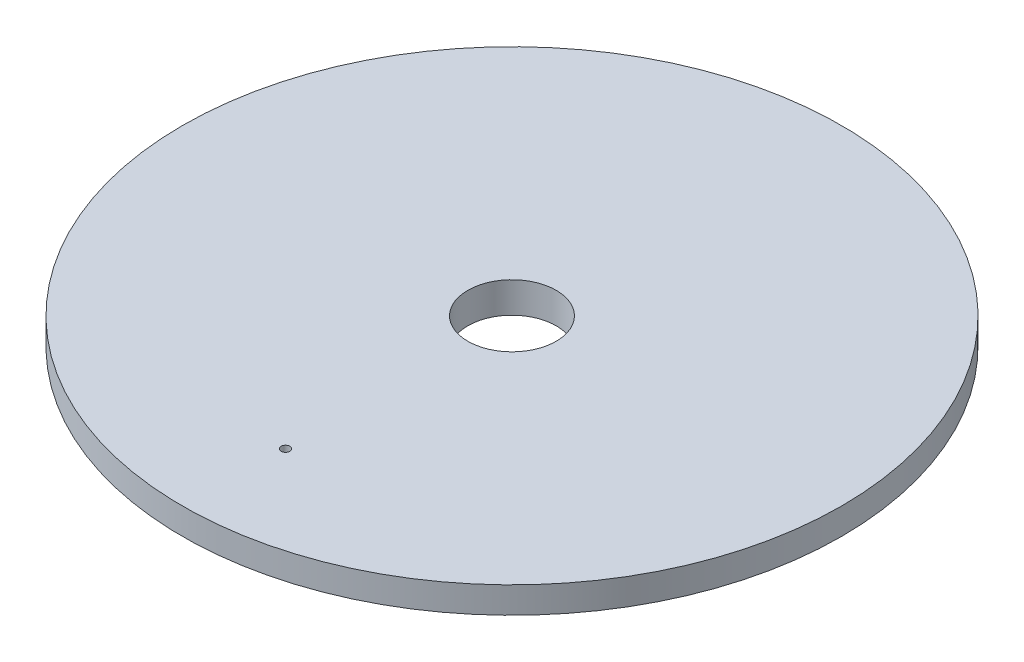
ISO-10303-21;
HEADER;
FILE_DESCRIPTION(('STEP AP214'),'2;1');
FILE_NAME('part.step','',(''),(''),'','','');
FILE_SCHEMA(('AUTOMOTIVE_DESIGN { 1 0 10303 214 1 1 1 1 }'));
ENDSEC;
DATA;
#1=APPLICATION_CONTEXT('core data for automotive mechanical design processes');
#2=APPLICATION_PROTOCOL_DEFINITION('international standard','automotive_design',2000,#1);
#3=PRODUCT_CONTEXT('',#1,'mechanical');
#4=PRODUCT('Part','Part','',(#3));
#5=PRODUCT_RELATED_PRODUCT_CATEGORY('part','',(#4));
#6=PRODUCT_DEFINITION_FORMATION('','',#4);
#7=PRODUCT_DEFINITION_CONTEXT('part definition',#1,'design');
#8=PRODUCT_DEFINITION('design','',#6,#7);
#9=PRODUCT_DEFINITION_SHAPE('','',#8);
#10=(LENGTH_UNIT() NAMED_UNIT(*) SI_UNIT(.MILLI.,.METRE.));
#11=(NAMED_UNIT(*) PLANE_ANGLE_UNIT() SI_UNIT($,.RADIAN.));
#12=(NAMED_UNIT(*) SI_UNIT($,.STERADIAN.) SOLID_ANGLE_UNIT());
#13=UNCERTAINTY_MEASURE_WITH_UNIT(LENGTH_MEASURE(1.E-05),#10,'distance_accuracy_value','');
#14=(GEOMETRIC_REPRESENTATION_CONTEXT(3) GLOBAL_UNCERTAINTY_ASSIGNED_CONTEXT((#13)) GLOBAL_UNIT_ASSIGNED_CONTEXT((#10,
#11,#12)) REPRESENTATION_CONTEXT('',''));
#15=CARTESIAN_POINT('',(0.,0.,0.));
#16=DIRECTION('',(0.,0.,1.));
#17=DIRECTION('',(1.,0.,0.));
#18=AXIS2_PLACEMENT_3D('',#15,#16,#17);
#19=CARTESIAN_POINT('',(0.,0.,0.));
#20=DIRECTION('',(0.,1.,0.));
#21=DIRECTION('',(-1.,0.,0.));
#22=AXIS2_PLACEMENT_3D('',#19,#20,#21);
#23=CYLINDRICAL_SURFACE('',#22,10.055);
#24=CARTESIAN_POINT('',(0.,-7.,0.));
#25=DIRECTION('',(0.,1.,0.));
#26=DIRECTION('',(-1.,0.,0.));
#27=AXIS2_PLACEMENT_3D('',#24,#25,#26);
#28=CIRCLE('',#27,10.055);
#29=CARTESIAN_POINT('',(-10.055,-7.,0.));
#30=VERTEX_POINT('',#29);
#31=EDGE_CURVE('E110',#30,#30,#28,.T.);
#32=ORIENTED_EDGE('',*,*,#31,.F.);
#33=EDGE_LOOP('',(#32));
#34=FACE_BOUND('',#33,.T.);
#35=CARTESIAN_POINT('',(0.,0.,0.));
#36=DIRECTION('',(0.,1.,0.));
#37=DIRECTION('',(-1.,0.,0.));
#38=AXIS2_PLACEMENT_3D('',#35,#36,#37);
#39=CIRCLE('',#38,10.055);
#40=CARTESIAN_POINT('',(-10.055,0.,0.));
#41=VERTEX_POINT('',#40);
#42=EDGE_CURVE('E10',#41,#41,#39,.T.);
#43=ORIENTED_EDGE('',*,*,#42,.T.);
#44=EDGE_LOOP('',(#43));
#45=FACE_BOUND('',#44,.T.);
#46=ADVANCED_FACE('F43',(#34,#45),#23,.F.);
#47=CARTESIAN_POINT('',(0.,0.,0.));
#48=DIRECTION('',(0.,1.,0.));
#49=DIRECTION('',(-1.,0.,0.));
#50=AXIS2_PLACEMENT_3D('',#47,#48,#49);
#51=PLANE('',#50);
#52=CARTESIAN_POINT('',(0.44346390972489,0.,51.9848151659545));
#53=DIRECTION('',(0.,1.,0.));
#54=DIRECTION('',(-1.,0.,0.));
#55=AXIS2_PLACEMENT_3D('',#52,#53,#54);
#56=CIRCLE('',#55,1.);
#57=CARTESIAN_POINT('',(-0.55653609027511,0.,51.9848151659545));
#58=VERTEX_POINT('',#57);
#59=EDGE_CURVE('E114',#58,#58,#56,.T.);
#60=ORIENTED_EDGE('',*,*,#59,.F.);
#61=EDGE_LOOP('',(#60));
#62=FACE_BOUND('',#61,.T.);
#63=CARTESIAN_POINT('',(0.,0.,0.));
#64=DIRECTION('',(0.,1.,0.));
#65=DIRECTION('',(-1.,0.,0.));
#66=AXIS2_PLACEMENT_3D('',#63,#64,#65);
#67=CIRCLE('',#66,75.);
#68=CARTESIAN_POINT('',(-75.,0.,0.));
#69=VERTEX_POINT('',#68);
#70=EDGE_CURVE('E50',#69,#69,#67,.T.);
#71=ORIENTED_EDGE('',*,*,#70,.T.);
#72=EDGE_LOOP('',(#71));
#73=FACE_BOUND('',#72,.T.);
#74=ORIENTED_EDGE('',*,*,#42,.F.);
#75=EDGE_LOOP('',(#74));
#76=FACE_BOUND('',#75,.T.);
#77=ADVANCED_FACE('F161',(#62,#73,#76),#51,.T.);
#78=CARTESIAN_POINT('',(0.,0.,0.));
#79=DIRECTION('',(0.,1.,0.));
#80=DIRECTION('',(-1.,0.,0.));
#81=AXIS2_PLACEMENT_3D('',#78,#79,#80);
#82=CYLINDRICAL_SURFACE('',#81,75.);
#83=CARTESIAN_POINT('',(0.,-6.,0.));
#84=DIRECTION('',(0.,1.,0.));
#85=DIRECTION('',(-1.,0.,0.));
#86=AXIS2_PLACEMENT_3D('',#83,#84,#85);
#87=CIRCLE('',#86,75.);
#88=CARTESIAN_POINT('',(-75.,-6.00000000000001,0.));
#89=VERTEX_POINT('',#88);
#90=EDGE_CURVE('E55',#89,#89,#87,.T.);
#91=ORIENTED_EDGE('',*,*,#90,.T.);
#92=EDGE_LOOP('',(#91));
#93=FACE_BOUND('',#92,.T.);
#94=ORIENTED_EDGE('',*,*,#70,.F.);
#95=EDGE_LOOP('',(#94));
#96=FACE_BOUND('',#95,.T.);
#97=ADVANCED_FACE('F155',(#93,#96),#82,.T.);
#98=CARTESIAN_POINT('',(0.,-6.,0.));
#99=DIRECTION('',(0.,-1.,0.));
#100=DIRECTION('',(1.,0.,0.));
#101=AXIS2_PLACEMENT_3D('',#98,#99,#100);
#102=PLANE('',#101);
#103=CARTESIAN_POINT('',(0.,-6.,0.));
#104=DIRECTION('',(0.,1.,0.));
#105=DIRECTION('',(-1.,0.,0.));
#106=AXIS2_PLACEMENT_3D('',#103,#104,#105);
#107=CIRCLE('',#106,59.4);
#108=CARTESIAN_POINT('',(-59.4,-6.00000000000001,0.));
#109=VERTEX_POINT('',#108);
#110=EDGE_CURVE('E60',#109,#109,#107,.T.);
#111=ORIENTED_EDGE('',*,*,#110,.T.);
#112=EDGE_LOOP('',(#111));
#113=FACE_BOUND('',#112,.T.);
#114=ORIENTED_EDGE('',*,*,#90,.F.);
#115=EDGE_LOOP('',(#114));
#116=FACE_BOUND('',#115,.T.);
#117=ADVANCED_FACE('F149',(#113,#116),#102,.T.);
#118=CARTESIAN_POINT('',(0.,0.,0.));
#119=DIRECTION('',(0.,1.,0.));
#120=DIRECTION('',(-1.,0.,0.));
#121=AXIS2_PLACEMENT_3D('',#118,#119,#120);
#122=CYLINDRICAL_SURFACE('',#121,59.4);
#123=CARTESIAN_POINT('',(0.,-2.9,0.));
#124=DIRECTION('',(0.,1.,0.));
#125=DIRECTION('',(-1.,0.,0.));
#126=AXIS2_PLACEMENT_3D('',#123,#124,#125);
#127=CIRCLE('',#126,59.4);
#128=CARTESIAN_POINT('',(-59.4,-2.90000000000001,0.));
#129=VERTEX_POINT('',#128);
#130=EDGE_CURVE('E66',#129,#129,#127,.T.);
#131=ORIENTED_EDGE('',*,*,#130,.T.);
#132=EDGE_LOOP('',(#131));
#133=FACE_BOUND('',#132,.T.);
#134=ORIENTED_EDGE('',*,*,#110,.F.);
#135=EDGE_LOOP('',(#134));
#136=FACE_BOUND('',#135,.T.);
#137=ADVANCED_FACE('F143',(#133,#136),#122,.F.);
#138=CARTESIAN_POINT('',(0.,-2.9,0.));
#139=DIRECTION('',(0.,-1.,0.));
#140=DIRECTION('',(1.,0.,0.));
#141=AXIS2_PLACEMENT_3D('',#138,#139,#140);
#142=PLANE('',#141);
#143=CARTESIAN_POINT('',(0.,-2.9,0.));
#144=DIRECTION('',(0.,1.,0.));
#145=DIRECTION('',(-1.,0.,0.));
#146=AXIS2_PLACEMENT_3D('',#143,#144,#145);
#147=CIRCLE('',#146,54.);
#148=CARTESIAN_POINT('',(-54.,-2.90000000000001,0.));
#149=VERTEX_POINT('',#148);
#150=EDGE_CURVE('E70',#149,#149,#147,.T.);
#151=ORIENTED_EDGE('',*,*,#150,.T.);
#152=EDGE_LOOP('',(#151));
#153=FACE_BOUND('',#152,.T.);
#154=ORIENTED_EDGE('',*,*,#130,.F.);
#155=EDGE_LOOP('',(#154));
#156=FACE_BOUND('',#155,.T.);
#157=ADVANCED_FACE('F137',(#153,#156),#142,.T.);
#158=CARTESIAN_POINT('',(0.,0.,0.));
#159=DIRECTION('',(0.,1.,0.));
#160=DIRECTION('',(-1.,0.,0.));
#161=AXIS2_PLACEMENT_3D('',#158,#159,#160);
#162=CYLINDRICAL_SURFACE('',#161,54.);
#163=CARTESIAN_POINT('',(0.,-6.,0.));
#164=DIRECTION('',(0.,1.,0.));
#165=DIRECTION('',(-1.,0.,0.));
#166=AXIS2_PLACEMENT_3D('',#163,#164,#165);
#167=CIRCLE('',#166,54.);
#168=CARTESIAN_POINT('',(-54.,-6.00000000000001,0.));
#169=VERTEX_POINT('',#168);
#170=EDGE_CURVE('E74',#169,#169,#167,.T.);
#171=ORIENTED_EDGE('',*,*,#170,.T.);
#172=EDGE_LOOP('',(#171));
#173=FACE_BOUND('',#172,.T.);
#174=ORIENTED_EDGE('',*,*,#150,.F.);
#175=EDGE_LOOP('',(#174));
#176=FACE_BOUND('',#175,.T.);
#177=ADVANCED_FACE('F129',(#173,#176),#162,.T.);
#178=CARTESIAN_POINT('',(0.,-6.,0.));
#179=DIRECTION('',(0.,-1.,0.));
#180=DIRECTION('',(1.,0.,0.));
#181=AXIS2_PLACEMENT_3D('',#178,#179,#180);
#182=PLANE('',#181);
#183=CARTESIAN_POINT('',(0.443463909724891,-6.,51.9848151659545));
#184=DIRECTION('',(0.,-1.,0.));
#185=DIRECTION('',(1.,0.,0.));
#186=AXIS2_PLACEMENT_3D('',#183,#184,#185);
#187=CIRCLE('',#186,1.);
#188=CARTESIAN_POINT('',(1.44346390972489,-6.,51.9848151659545));
#189=VERTEX_POINT('',#188);
#190=EDGE_CURVE('E118',#189,#189,#187,.T.);
#191=ORIENTED_EDGE('',*,*,#190,.F.);
#192=EDGE_LOOP('',(#191));
#193=FACE_BOUND('',#192,.T.);
#194=CARTESIAN_POINT('',(0.,-6.,0.));
#195=DIRECTION('',(0.,1.,0.));
#196=DIRECTION('',(-1.,0.,0.));
#197=AXIS2_PLACEMENT_3D('',#194,#195,#196);
#198=CIRCLE('',#197,50.);
#199=CARTESIAN_POINT('',(-50.,-6.00000000000001,0.));
#200=VERTEX_POINT('',#199);
#201=EDGE_CURVE('E78',#200,#200,#198,.T.);
#202=ORIENTED_EDGE('',*,*,#201,.T.);
#203=EDGE_LOOP('',(#202));
#204=FACE_BOUND('',#203,.T.);
#205=ORIENTED_EDGE('',*,*,#170,.F.);
#206=EDGE_LOOP('',(#205));
#207=FACE_BOUND('',#206,.T.);
#208=ADVANCED_FACE('F125',(#193,#204,#207),#182,.T.);
#209=CARTESIAN_POINT('',(0.,0.,0.));
#210=DIRECTION('',(0.,1.,0.));
#211=DIRECTION('',(-1.,0.,0.));
#212=AXIS2_PLACEMENT_3D('',#209,#210,#211);
#213=CYLINDRICAL_SURFACE('',#212,50.);
#214=CARTESIAN_POINT('',(0.,-7.2,0.));
#215=DIRECTION('',(0.,1.,0.));
#216=DIRECTION('',(-1.,0.,0.));
#217=AXIS2_PLACEMENT_3D('',#214,#215,#216);
#218=CIRCLE('',#217,50.);
#219=CARTESIAN_POINT('',(-50.,-7.20000000000001,0.));
#220=VERTEX_POINT('',#219);
#221=EDGE_CURVE('E82',#220,#220,#218,.T.);
#222=ORIENTED_EDGE('',*,*,#221,.T.);
#223=EDGE_LOOP('',(#222));
#224=FACE_BOUND('',#223,.T.);
#225=ORIENTED_EDGE('',*,*,#201,.F.);
#226=EDGE_LOOP('',(#225));
#227=FACE_BOUND('',#226,.T.);
#228=ADVANCED_FACE('F128',(#224,#227),#213,.T.);
#229=CARTESIAN_POINT('',(0.,-7.2,0.));
#230=DIRECTION('',(0.,-1.,0.));
#231=DIRECTION('',(1.,0.,0.));
#232=AXIS2_PLACEMENT_3D('',#229,#230,#231);
#233=PLANE('',#232);
#234=CARTESIAN_POINT('',(0.,-7.2,0.));
#235=DIRECTION('',(0.,1.,0.));
#236=DIRECTION('',(-1.,0.,0.));
#237=AXIS2_PLACEMENT_3D('',#234,#235,#236);
#238=CIRCLE('',#237,46.9);
#239=CARTESIAN_POINT('',(-46.9,-7.20000000000001,0.));
#240=VERTEX_POINT('',#239);
#241=EDGE_CURVE('E86',#240,#240,#238,.T.);
#242=ORIENTED_EDGE('',*,*,#241,.T.);
#243=EDGE_LOOP('',(#242));
#244=FACE_BOUND('',#243,.T.);
#245=ORIENTED_EDGE('',*,*,#221,.F.);
#246=EDGE_LOOP('',(#245));
#247=FACE_BOUND('',#246,.T.);
#248=ADVANCED_FACE('F203',(#244,#247),#233,.T.);
#249=CARTESIAN_POINT('',(0.,0.,0.));
#250=DIRECTION('',(0.,1.,0.));
#251=DIRECTION('',(-1.,0.,0.));
#252=AXIS2_PLACEMENT_3D('',#249,#250,#251);
#253=CYLINDRICAL_SURFACE('',#252,46.9);
#254=CARTESIAN_POINT('',(0.,-12.5,0.));
#255=DIRECTION('',(0.,1.,0.));
#256=DIRECTION('',(-1.,0.,0.));
#257=AXIS2_PLACEMENT_3D('',#254,#255,#256);
#258=CIRCLE('',#257,46.9);
#259=CARTESIAN_POINT('',(-46.9,-12.5,0.));
#260=VERTEX_POINT('',#259);
#261=EDGE_CURVE('E90',#260,#260,#258,.T.);
#262=ORIENTED_EDGE('',*,*,#261,.T.);
#263=EDGE_LOOP('',(#262));
#264=FACE_BOUND('',#263,.T.);
#265=ORIENTED_EDGE('',*,*,#241,.F.);
#266=EDGE_LOOP('',(#265));
#267=FACE_BOUND('',#266,.T.);
#268=ADVANCED_FACE('F199',(#264,#267),#253,.T.);
#269=CARTESIAN_POINT('',(0.,-12.5,0.));
#270=DIRECTION('',(0.,1.,0.));
#271=DIRECTION('',(-1.,0.,0.));
#272=AXIS2_PLACEMENT_3D('',#269,#270,#271);
#273=PLANE('',#272);
#274=CARTESIAN_POINT('',(0.,-12.5,0.));
#275=DIRECTION('',(0.,1.,0.));
#276=DIRECTION('',(-1.,0.,0.));
#277=AXIS2_PLACEMENT_3D('',#274,#275,#276);
#278=CIRCLE('',#277,50.);
#279=CARTESIAN_POINT('',(-50.,-12.5,0.));
#280=VERTEX_POINT('',#279);
#281=EDGE_CURVE('E94',#280,#280,#278,.T.);
#282=ORIENTED_EDGE('',*,*,#281,.T.);
#283=EDGE_LOOP('',(#282));
#284=FACE_BOUND('',#283,.T.);
#285=ORIENTED_EDGE('',*,*,#261,.F.);
#286=EDGE_LOOP('',(#285));
#287=FACE_BOUND('',#286,.T.);
#288=ADVANCED_FACE('F195',(#284,#287),#273,.T.);
#289=CARTESIAN_POINT('',(0.,0.,0.));
#290=DIRECTION('',(0.,1.,0.));
#291=DIRECTION('',(-1.,0.,0.));
#292=AXIS2_PLACEMENT_3D('',#289,#290,#291);
#293=CYLINDRICAL_SURFACE('',#292,50.);
#294=CARTESIAN_POINT('',(0.,-14.2515529446518,0.));
#295=DIRECTION('',(0.,1.,0.));
#296=DIRECTION('',(-1.,0.,0.));
#297=AXIS2_PLACEMENT_3D('',#294,#295,#296);
#298=CIRCLE('',#297,50.);
#299=CARTESIAN_POINT('',(-50.,-14.2515529446518,0.));
#300=VERTEX_POINT('',#299);
#301=EDGE_CURVE('E98',#300,#300,#298,.T.);
#302=ORIENTED_EDGE('',*,*,#301,.T.);
#303=EDGE_LOOP('',(#302));
#304=FACE_BOUND('',#303,.T.);
#305=ORIENTED_EDGE('',*,*,#281,.F.);
#306=EDGE_LOOP('',(#305));
#307=FACE_BOUND('',#306,.T.);
#308=ADVANCED_FACE('F191',(#304,#307),#293,.T.);
#309=CARTESIAN_POINT('',(0.,-14.2515529446518,0.));
#310=DIRECTION('',(0.,-1.,0.));
#311=DIRECTION('',(1.,0.,0.));
#312=AXIS2_PLACEMENT_3D('',#309,#310,#311);
#313=PLANE('',#312);
#314=CARTESIAN_POINT('',(0.,-14.2515529446518,0.));
#315=DIRECTION('',(0.,1.,0.));
#316=DIRECTION('',(-1.,0.,0.));
#317=AXIS2_PLACEMENT_3D('',#314,#315,#316);
#318=CIRCLE('',#317,45.);
#319=CARTESIAN_POINT('',(-45.,-14.2515529446518,0.));
#320=VERTEX_POINT('',#319);
#321=EDGE_CURVE('E102',#320,#320,#318,.T.);
#322=ORIENTED_EDGE('',*,*,#321,.T.);
#323=EDGE_LOOP('',(#322));
#324=FACE_BOUND('',#323,.T.);
#325=ORIENTED_EDGE('',*,*,#301,.F.);
#326=EDGE_LOOP('',(#325));
#327=FACE_BOUND('',#326,.T.);
#328=ADVANCED_FACE('F184',(#324,#327),#313,.T.);
#329=CARTESIAN_POINT('',(0.,-7.,0.));
#330=DIRECTION('',(0.,-1.,0.));
#331=DIRECTION('',(1.,0.,0.));
#332=AXIS2_PLACEMENT_3D('',#329,#330,#331);
#333=CONICAL_SURFACE('',#332,43.721355563822,0.174532925199429);
#334=ORIENTED_EDGE('',*,*,#321,.F.);
#335=EDGE_LOOP('',(#334));
#336=FACE_BOUND('',#335,.T.);
#337=CARTESIAN_POINT('',(0.,-7.,0.));
#338=DIRECTION('',(0.,1.,0.));
#339=DIRECTION('',(-1.,0.,0.));
#340=AXIS2_PLACEMENT_3D('',#337,#338,#339);
#341=CIRCLE('',#340,43.721355563822);
#342=CARTESIAN_POINT('',(-43.721355563822,-7.,0.));
#343=VERTEX_POINT('',#342);
#344=EDGE_CURVE('E106',#343,#343,#341,.T.);
#345=ORIENTED_EDGE('',*,*,#344,.T.);
#346=EDGE_LOOP('',(#345));
#347=FACE_BOUND('',#346,.T.);
#348=ADVANCED_FACE('F175',(#336,#347),#333,.F.);
#349=CARTESIAN_POINT('',(0.,-7.,0.));
#350=DIRECTION('',(0.,1.,0.));
#351=DIRECTION('',(-1.,0.,0.));
#352=AXIS2_PLACEMENT_3D('',#349,#350,#351);
#353=PLANE('',#352);
#354=ORIENTED_EDGE('',*,*,#344,.F.);
#355=EDGE_LOOP('',(#354));
#356=FACE_BOUND('',#355,.T.);
#357=ORIENTED_EDGE('',*,*,#31,.T.);
#358=EDGE_LOOP('',(#357));
#359=FACE_BOUND('',#358,.T.);
#360=ADVANCED_FACE('F173',(#356,#359),#353,.F.);
#361=CARTESIAN_POINT('',(0.44346390972489,4.,51.9848151659545));
#362=DIRECTION('',(0.,-1.,0.));
#363=DIRECTION('',(1.,0.,0.));
#364=AXIS2_PLACEMENT_3D('',#361,#362,#363);
#365=CYLINDRICAL_SURFACE('',#364,1.);
#366=ORIENTED_EDGE('',*,*,#59,.T.);
#367=EDGE_LOOP('',(#366));
#368=FACE_BOUND('',#367,.T.);
#369=ORIENTED_EDGE('',*,*,#190,.T.);
#370=EDGE_LOOP('',(#369));
#371=FACE_BOUND('',#370,.T.);
#372=ADVANCED_FACE('F123',(#368,#371),#365,.F.);
#373=CLOSED_SHELL('',(#46,#77,#97,#117,#137,#157,#177,#208,#228,#248,#268,#288,#308,#328,#348,
#360,#372));
#374=MANIFOLD_SOLID_BREP('B2',#373);
#375=ADVANCED_BREP_SHAPE_REPRESENTATION('',(#18,#374),#14);
#376=SHAPE_DEFINITION_REPRESENTATION(#9,#375);
ENDSEC;
END-ISO-10303-21;
